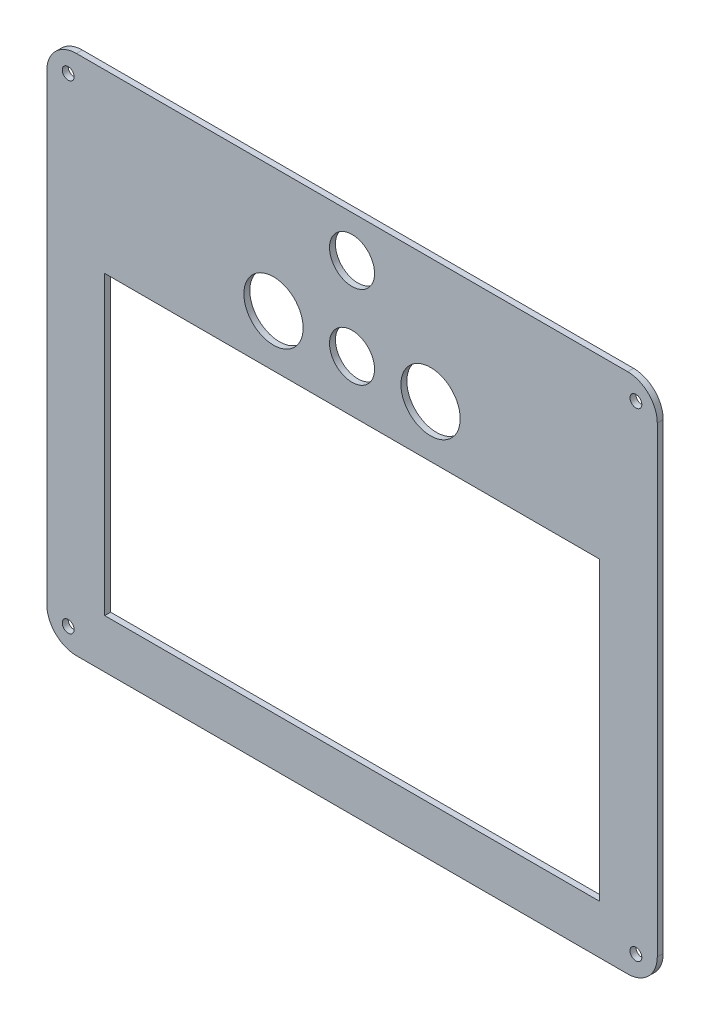
ISO-10303-21;
HEADER;
FILE_DESCRIPTION(('STEP AP214'),'2;1');
FILE_NAME('part.step','',(''),(''),'','','');
FILE_SCHEMA(('AUTOMOTIVE_DESIGN { 1 0 10303 214 1 1 1 1 }'));
ENDSEC;
DATA;
#1=APPLICATION_CONTEXT('core data for automotive mechanical design processes');
#2=APPLICATION_PROTOCOL_DEFINITION('international standard','automotive_design',2000,#1);
#3=PRODUCT_CONTEXT('',#1,'mechanical');
#4=PRODUCT('Part','Part','',(#3));
#5=PRODUCT_RELATED_PRODUCT_CATEGORY('part','',(#4));
#6=PRODUCT_DEFINITION_FORMATION('','',#4);
#7=PRODUCT_DEFINITION_CONTEXT('part definition',#1,'design');
#8=PRODUCT_DEFINITION('design','',#6,#7);
#9=PRODUCT_DEFINITION_SHAPE('','',#8);
#10=(LENGTH_UNIT() NAMED_UNIT(*) SI_UNIT(.MILLI.,.METRE.));
#11=(NAMED_UNIT(*) PLANE_ANGLE_UNIT() SI_UNIT($,.RADIAN.));
#12=(NAMED_UNIT(*) SI_UNIT($,.STERADIAN.) SOLID_ANGLE_UNIT());
#13=UNCERTAINTY_MEASURE_WITH_UNIT(LENGTH_MEASURE(1.E-05),#10,'distance_accuracy_value','');
#14=(GEOMETRIC_REPRESENTATION_CONTEXT(3) GLOBAL_UNCERTAINTY_ASSIGNED_CONTEXT((#13)) GLOBAL_UNIT_ASSIGNED_CONTEXT((#10,
#11,#12)) REPRESENTATION_CONTEXT('',''));
#15=CARTESIAN_POINT('',(0.,0.,0.));
#16=DIRECTION('',(0.,0.,1.));
#17=DIRECTION('',(1.,0.,0.));
#18=AXIS2_PLACEMENT_3D('',#15,#16,#17);
#19=CARTESIAN_POINT('',(0.,0.,2.));
#20=DIRECTION('',(1.,0.,0.));
#21=DIRECTION('',(0.,1.,0.));
#22=AXIS2_PLACEMENT_3D('',#19,#20,#21);
#23=PLANE('',#22);
#24=DIRECTION('',(0.,-1.,0.));
#25=VECTOR('',#24,1.);
#26=CARTESIAN_POINT('',(0.,0.,0.));
#27=LINE('',#26,#25);
#28=CARTESIAN_POINT('',(0.,-10.,0.));
#29=VERTEX_POINT('',#28);
#30=CARTESIAN_POINT('',(0.,-166.,0.));
#31=VERTEX_POINT('',#30);
#32=EDGE_CURVE('E230',#29,#31,#27,.T.);
#33=ORIENTED_EDGE('',*,*,#32,.T.);
#34=DIRECTION('',(0.,0.,-1.));
#35=VECTOR('',#34,1.);
#36=CARTESIAN_POINT('',(0.,-166.,2.));
#37=LINE('',#36,#35);
#38=CARTESIAN_POINT('',(0.,-166.,2.));
#39=VERTEX_POINT('',#38);
#40=EDGE_CURVE('E304',#31,#39,#37,.F.);
#41=ORIENTED_EDGE('',*,*,#40,.T.);
#42=DIRECTION('',(0.,-1.,0.));
#43=VECTOR('',#42,1.);
#44=CARTESIAN_POINT('',(0.,0.,2.));
#45=LINE('',#44,#43);
#46=CARTESIAN_POINT('',(0.,-10.,2.));
#47=VERTEX_POINT('',#46);
#48=EDGE_CURVE('E231',#47,#39,#45,.T.);
#49=ORIENTED_EDGE('',*,*,#48,.F.);
#50=DIRECTION('',(0.,0.,-1.));
#51=VECTOR('',#50,1.);
#52=CARTESIAN_POINT('',(0.,-10.,2.));
#53=LINE('',#52,#51);
#54=EDGE_CURVE('E300',#47,#29,#53,.T.);
#55=ORIENTED_EDGE('',*,*,#54,.T.);
#56=EDGE_LOOP('',(#33,#41,#49,#55));
#57=FACE_BOUND('',#56,.T.);
#58=ADVANCED_FACE('F41',(#57),#23,.F.);
#59=CARTESIAN_POINT('',(0.,-176.,2.));
#60=DIRECTION('',(0.,1.,0.));
#61=DIRECTION('',(0.,0.,1.));
#62=AXIS2_PLACEMENT_3D('',#59,#60,#61);
#63=PLANE('',#62);
#64=DIRECTION('',(1.,0.,0.));
#65=VECTOR('',#64,1.);
#66=CARTESIAN_POINT('',(0.,-176.,0.));
#67=LINE('',#66,#65);
#68=CARTESIAN_POINT('',(10.,-176.,0.));
#69=VERTEX_POINT('',#68);
#70=CARTESIAN_POINT('',(196.,-176.,0.));
#71=VERTEX_POINT('',#70);
#72=EDGE_CURVE('E252',#69,#71,#67,.T.);
#73=ORIENTED_EDGE('',*,*,#72,.T.);
#74=DIRECTION('',(0.,0.,-1.));
#75=VECTOR('',#74,1.);
#76=CARTESIAN_POINT('',(196.,-176.,2.));
#77=LINE('',#76,#75);
#78=CARTESIAN_POINT('',(196.,-176.,2.));
#79=VERTEX_POINT('',#78);
#80=EDGE_CURVE('E285',#71,#79,#77,.F.);
#81=ORIENTED_EDGE('',*,*,#80,.T.);
#82=DIRECTION('',(1.,0.,0.));
#83=VECTOR('',#82,1.);
#84=CARTESIAN_POINT('',(0.,-176.,2.));
#85=LINE('',#84,#83);
#86=CARTESIAN_POINT('',(10.,-176.,2.));
#87=VERTEX_POINT('',#86);
#88=EDGE_CURVE('E235',#87,#79,#85,.T.);
#89=ORIENTED_EDGE('',*,*,#88,.F.);
#90=DIRECTION('',(0.,0.,-1.));
#91=VECTOR('',#90,1.);
#92=CARTESIAN_POINT('',(10.,-176.,2.));
#93=LINE('',#92,#91);
#94=EDGE_CURVE('E281',#87,#69,#93,.T.);
#95=ORIENTED_EDGE('',*,*,#94,.T.);
#96=EDGE_LOOP('',(#73,#81,#89,#95));
#97=FACE_BOUND('',#96,.T.);
#98=ADVANCED_FACE('F341',(#97),#63,.F.);
#99=CARTESIAN_POINT('',(206.,0.,2.));
#100=DIRECTION('',(-1.,0.,0.));
#101=DIRECTION('',(0.,-1.,0.));
#102=AXIS2_PLACEMENT_3D('',#99,#100,#101);
#103=PLANE('',#102);
#104=DIRECTION('',(0.,1.,0.));
#105=VECTOR('',#104,1.);
#106=CARTESIAN_POINT('',(206.,0.,2.));
#107=LINE('',#106,#105);
#108=CARTESIAN_POINT('',(206.,-166.,2.));
#109=VERTEX_POINT('',#108);
#110=CARTESIAN_POINT('',(206.,-10.,2.));
#111=VERTEX_POINT('',#110);
#112=EDGE_CURVE('E240',#109,#111,#107,.T.);
#113=ORIENTED_EDGE('',*,*,#112,.F.);
#114=DIRECTION('',(0.,0.,-1.));
#115=VECTOR('',#114,1.);
#116=CARTESIAN_POINT('',(206.,-166.,2.));
#117=LINE('',#116,#115);
#118=CARTESIAN_POINT('',(206.,-166.,0.));
#119=VERTEX_POINT('',#118);
#120=EDGE_CURVE('E265',#109,#119,#117,.T.);
#121=ORIENTED_EDGE('',*,*,#120,.T.);
#122=DIRECTION('',(0.,1.,0.));
#123=VECTOR('',#122,1.);
#124=CARTESIAN_POINT('',(206.,0.,0.));
#125=LINE('',#124,#123);
#126=CARTESIAN_POINT('',(206.,-10.,0.));
#127=VERTEX_POINT('',#126);
#128=EDGE_CURVE('E256',#119,#127,#125,.T.);
#129=ORIENTED_EDGE('',*,*,#128,.T.);
#130=DIRECTION('',(0.,0.,-1.));
#131=VECTOR('',#130,1.);
#132=CARTESIAN_POINT('',(206.,-10.,2.));
#133=LINE('',#132,#131);
#134=EDGE_CURVE('E248',#127,#111,#133,.F.);
#135=ORIENTED_EDGE('',*,*,#134,.T.);
#136=EDGE_LOOP('',(#113,#121,#129,#135));
#137=FACE_BOUND('',#136,.T.);
#138=ADVANCED_FACE('F347',(#137),#103,.F.);
#139=CARTESIAN_POINT('',(0.,0.,2.));
#140=DIRECTION('',(0.,-1.,0.));
#141=DIRECTION('',(0.,0.,-1.));
#142=AXIS2_PLACEMENT_3D('',#139,#140,#141);
#143=PLANE('',#142);
#144=DIRECTION('',(-1.,0.,0.));
#145=VECTOR('',#144,1.);
#146=CARTESIAN_POINT('',(0.,0.,0.));
#147=LINE('',#146,#145);
#148=CARTESIAN_POINT('',(196.,0.,0.));
#149=VERTEX_POINT('',#148);
#150=CARTESIAN_POINT('',(10.,0.,0.));
#151=VERTEX_POINT('',#150);
#152=EDGE_CURVE('E236',#149,#151,#147,.T.);
#153=ORIENTED_EDGE('',*,*,#152,.T.);
#154=DIRECTION('',(0.,0.,-1.));
#155=VECTOR('',#154,1.);
#156=CARTESIAN_POINT('',(10.,0.,2.));
#157=LINE('',#156,#155);
#158=CARTESIAN_POINT('',(10.,0.,2.));
#159=VERTEX_POINT('',#158);
#160=EDGE_CURVE('E311',#151,#159,#157,.F.);
#161=ORIENTED_EDGE('',*,*,#160,.T.);
#162=DIRECTION('',(-1.,0.,0.));
#163=VECTOR('',#162,1.);
#164=CARTESIAN_POINT('',(0.,0.,2.));
#165=LINE('',#164,#163);
#166=CARTESIAN_POINT('',(196.,0.,2.));
#167=VERTEX_POINT('',#166);
#168=EDGE_CURVE('E244',#167,#159,#165,.T.);
#169=ORIENTED_EDGE('',*,*,#168,.F.);
#170=DIRECTION('',(0.,0.,-1.));
#171=VECTOR('',#170,1.);
#172=CARTESIAN_POINT('',(196.,0.,2.));
#173=LINE('',#172,#171);
#174=EDGE_CURVE('E307',#167,#149,#173,.T.);
#175=ORIENTED_EDGE('',*,*,#174,.T.);
#176=EDGE_LOOP('',(#153,#161,#169,#175));
#177=FACE_BOUND('',#176,.T.);
#178=ADVANCED_FACE('F389',(#177),#143,.F.);
#179=CARTESIAN_POINT('',(0.,0.,2.));
#180=DIRECTION('',(0.,0.,1.));
#181=DIRECTION('',(1.,0.,0.));
#182=AXIS2_PLACEMENT_3D('',#179,#180,#181);
#183=PLANE('',#182);
#184=DIRECTION('',(0.,-1.,0.));
#185=VECTOR('',#184,1.);
#186=CARTESIAN_POINT('',(19.55,0.,2.));
#187=LINE('',#186,#185);
#188=CARTESIAN_POINT('',(19.55,-59.5,2.));
#189=VERTEX_POINT('',#188);
#190=CARTESIAN_POINT('',(19.55,-159.5,2.));
#191=VERTEX_POINT('',#190);
#192=EDGE_CURVE('E57',#189,#191,#187,.T.);
#193=ORIENTED_EDGE('',*,*,#192,.F.);
#194=DIRECTION('',(1.,0.,0.));
#195=VECTOR('',#194,1.);
#196=CARTESIAN_POINT('',(0.,-59.5,2.));
#197=LINE('',#196,#195);
#198=CARTESIAN_POINT('',(186.45,-59.5,2.));
#199=VERTEX_POINT('',#198);
#200=EDGE_CURVE('E152',#189,#199,#197,.T.);
#201=ORIENTED_EDGE('',*,*,#200,.T.);
#202=DIRECTION('',(0.,-1.,0.));
#203=VECTOR('',#202,1.);
#204=CARTESIAN_POINT('',(186.45,0.,2.));
#205=LINE('',#204,#203);
#206=CARTESIAN_POINT('',(186.45,-159.5,2.));
#207=VERTEX_POINT('',#206);
#208=EDGE_CURVE('E134',#199,#207,#205,.T.);
#209=ORIENTED_EDGE('',*,*,#208,.T.);
#210=DIRECTION('',(1.,0.,0.));
#211=VECTOR('',#210,1.);
#212=CARTESIAN_POINT('',(0.,-159.5,2.));
#213=LINE('',#212,#211);
#214=EDGE_CURVE('E144',#191,#207,#213,.T.);
#215=ORIENTED_EDGE('',*,*,#214,.F.);
#216=EDGE_LOOP('',(#193,#201,#209,#215));
#217=FACE_BOUND('',#216,.T.);
#218=CARTESIAN_POINT('',(103.,-14.,2.));
#219=DIRECTION('',(0.,0.,1.));
#220=DIRECTION('',(1.,0.,0.));
#221=AXIS2_PLACEMENT_3D('',#218,#219,#220);
#222=CIRCLE('',#221,7.59999999999999);
#223=CARTESIAN_POINT('',(110.6,-14.,2.));
#224=VERTEX_POINT('',#223);
#225=EDGE_CURVE('E194',#224,#224,#222,.T.);
#226=ORIENTED_EDGE('',*,*,#225,.F.);
#227=EDGE_LOOP('',(#226));
#228=FACE_BOUND('',#227,.T.);
#229=CARTESIAN_POINT('',(129.5,-42.,2.));
#230=DIRECTION('',(0.,0.,1.));
#231=DIRECTION('',(1.,0.,0.));
#232=AXIS2_PLACEMENT_3D('',#229,#230,#231);
#233=CIRCLE('',#232,9.99999999999999);
#234=CARTESIAN_POINT('',(139.5,-42.,2.));
#235=VERTEX_POINT('',#234);
#236=EDGE_CURVE('E190',#235,#235,#233,.T.);
#237=ORIENTED_EDGE('',*,*,#236,.F.);
#238=EDGE_LOOP('',(#237));
#239=FACE_BOUND('',#238,.T.);
#240=CARTESIAN_POINT('',(103.,-42.,2.));
#241=DIRECTION('',(0.,0.,1.));
#242=DIRECTION('',(1.,0.,0.));
#243=AXIS2_PLACEMENT_3D('',#240,#241,#242);
#244=CIRCLE('',#243,7.6);
#245=CARTESIAN_POINT('',(110.6,-42.,2.));
#246=VERTEX_POINT('',#245);
#247=EDGE_CURVE('E186',#246,#246,#244,.T.);
#248=ORIENTED_EDGE('',*,*,#247,.F.);
#249=EDGE_LOOP('',(#248));
#250=FACE_BOUND('',#249,.T.);
#251=CARTESIAN_POINT('',(76.5,-42.,2.));
#252=DIRECTION('',(0.,0.,1.));
#253=DIRECTION('',(1.,0.,0.));
#254=AXIS2_PLACEMENT_3D('',#251,#252,#253);
#255=CIRCLE('',#254,9.99999999999999);
#256=CARTESIAN_POINT('',(86.5,-42.,2.));
#257=VERTEX_POINT('',#256);
#258=EDGE_CURVE('E171',#257,#257,#255,.T.);
#259=ORIENTED_EDGE('',*,*,#258,.F.);
#260=EDGE_LOOP('',(#259));
#261=FACE_BOUND('',#260,.T.);
#262=CARTESIAN_POINT('',(198.78553391,-168.78553391,2.));
#263=DIRECTION('',(0.,0.,1.));
#264=DIRECTION('',(1.,0.,0.));
#265=AXIS2_PLACEMENT_3D('',#262,#263,#264);
#266=CIRCLE('',#265,2.);
#267=CARTESIAN_POINT('',(200.78553391,-168.78553391,2.));
#268=VERTEX_POINT('',#267);
#269=EDGE_CURVE('E226',#268,#268,#266,.T.);
#270=ORIENTED_EDGE('',*,*,#269,.F.);
#271=EDGE_LOOP('',(#270));
#272=FACE_BOUND('',#271,.T.);
#273=CARTESIAN_POINT('',(7.21446609,-168.78553391,2.));
#274=DIRECTION('',(0.,0.,1.));
#275=DIRECTION('',(1.,0.,0.));
#276=AXIS2_PLACEMENT_3D('',#273,#274,#275);
#277=CIRCLE('',#276,2.);
#278=CARTESIAN_POINT('',(9.21446609000001,-168.78553391,2.));
#279=VERTEX_POINT('',#278);
#280=EDGE_CURVE('E222',#279,#279,#277,.T.);
#281=ORIENTED_EDGE('',*,*,#280,.F.);
#282=EDGE_LOOP('',(#281));
#283=FACE_BOUND('',#282,.T.);
#284=CARTESIAN_POINT('',(7.21446609,-7.21446609000001,2.));
#285=DIRECTION('',(0.,0.,1.));
#286=DIRECTION('',(1.,0.,0.));
#287=AXIS2_PLACEMENT_3D('',#284,#285,#286);
#288=CIRCLE('',#287,2.);
#289=CARTESIAN_POINT('',(9.21446609,-7.21446609000001,2.));
#290=VERTEX_POINT('',#289);
#291=EDGE_CURVE('E218',#290,#290,#288,.T.);
#292=ORIENTED_EDGE('',*,*,#291,.F.);
#293=EDGE_LOOP('',(#292));
#294=FACE_BOUND('',#293,.T.);
#295=CARTESIAN_POINT('',(198.78553391,-7.21446609000001,2.));
#296=DIRECTION('',(0.,0.,1.));
#297=DIRECTION('',(1.,0.,0.));
#298=AXIS2_PLACEMENT_3D('',#295,#296,#297);
#299=CIRCLE('',#298,2.);
#300=CARTESIAN_POINT('',(200.78553391,-7.21446609000001,2.));
#301=VERTEX_POINT('',#300);
#302=EDGE_CURVE('E214',#301,#301,#299,.T.);
#303=ORIENTED_EDGE('',*,*,#302,.F.);
#304=EDGE_LOOP('',(#303));
#305=FACE_BOUND('',#304,.T.);
#306=ORIENTED_EDGE('',*,*,#88,.T.);
#307=CARTESIAN_POINT('',(196.,-166.,2.));
#308=DIRECTION('',(0.,0.,1.));
#309=DIRECTION('',(1.,0.,0.));
#310=AXIS2_PLACEMENT_3D('',#307,#308,#309);
#311=CIRCLE('',#310,10.);
#312=EDGE_CURVE('E297',#79,#109,#311,.T.);
#313=ORIENTED_EDGE('',*,*,#312,.T.);
#314=ORIENTED_EDGE('',*,*,#112,.T.);
#315=CARTESIAN_POINT('',(196.,-10.,2.));
#316=DIRECTION('',(0.,0.,1.));
#317=DIRECTION('',(1.,0.,0.));
#318=AXIS2_PLACEMENT_3D('',#315,#316,#317);
#319=CIRCLE('',#318,10.);
#320=EDGE_CURVE('E288',#111,#167,#319,.T.);
#321=ORIENTED_EDGE('',*,*,#320,.T.);
#322=ORIENTED_EDGE('',*,*,#168,.T.);
#323=CARTESIAN_POINT('',(10.,-10.,2.));
#324=DIRECTION('',(0.,0.,1.));
#325=DIRECTION('',(1.,0.,0.));
#326=AXIS2_PLACEMENT_3D('',#323,#324,#325);
#327=CIRCLE('',#326,10.);
#328=EDGE_CURVE('E291',#159,#47,#327,.T.);
#329=ORIENTED_EDGE('',*,*,#328,.T.);
#330=ORIENTED_EDGE('',*,*,#48,.T.);
#331=CARTESIAN_POINT('',(10.,-166.,2.));
#332=DIRECTION('',(0.,0.,1.));
#333=DIRECTION('',(1.,0.,0.));
#334=AXIS2_PLACEMENT_3D('',#331,#332,#333);
#335=CIRCLE('',#334,10.);
#336=EDGE_CURVE('E294',#39,#87,#335,.T.);
#337=ORIENTED_EDGE('',*,*,#336,.T.);
#338=EDGE_LOOP('',(#306,#313,#314,#321,#322,#329,#330,#337));
#339=FACE_BOUND('',#338,.T.);
#340=ADVANCED_FACE('F149',(#217,#228,#239,#250,#261,#272,#283,#294,#305,#339),#183,.T.);
#341=CARTESIAN_POINT('',(0.,0.,0.));
#342=DIRECTION('',(0.,0.,1.));
#343=DIRECTION('',(1.,0.,0.));
#344=AXIS2_PLACEMENT_3D('',#341,#342,#343);
#345=PLANE('',#344);
#346=DIRECTION('',(1.,0.,0.));
#347=VECTOR('',#346,1.);
#348=CARTESIAN_POINT('',(0.,-59.5,0.));
#349=LINE('',#348,#347);
#350=CARTESIAN_POINT('',(19.55,-59.5,0.));
#351=VERTEX_POINT('',#350);
#352=CARTESIAN_POINT('',(186.45,-59.5,0.));
#353=VERTEX_POINT('',#352);
#354=EDGE_CURVE('E50',#351,#353,#349,.T.);
#355=ORIENTED_EDGE('',*,*,#354,.F.);
#356=DIRECTION('',(0.,-1.,0.));
#357=VECTOR('',#356,1.);
#358=CARTESIAN_POINT('',(19.55,0.,0.));
#359=LINE('',#358,#357);
#360=CARTESIAN_POINT('',(19.55,-159.5,0.));
#361=VERTEX_POINT('',#360);
#362=EDGE_CURVE('E11',#351,#361,#359,.T.);
#363=ORIENTED_EDGE('',*,*,#362,.T.);
#364=DIRECTION('',(1.,0.,0.));
#365=VECTOR('',#364,1.);
#366=CARTESIAN_POINT('',(0.,-159.5,0.));
#367=LINE('',#366,#365);
#368=CARTESIAN_POINT('',(186.45,-159.5,0.));
#369=VERTEX_POINT('',#368);
#370=EDGE_CURVE('E314',#361,#369,#367,.T.);
#371=ORIENTED_EDGE('',*,*,#370,.T.);
#372=DIRECTION('',(0.,-1.,0.));
#373=VECTOR('',#372,1.);
#374=CARTESIAN_POINT('',(186.45,0.,0.));
#375=LINE('',#374,#373);
#376=EDGE_CURVE('E137',#353,#369,#375,.T.);
#377=ORIENTED_EDGE('',*,*,#376,.F.);
#378=EDGE_LOOP('',(#355,#363,#371,#377));
#379=FACE_BOUND('',#378,.T.);
#380=CARTESIAN_POINT('',(103.,-14.,0.));
#381=DIRECTION('',(0.,0.,-1.));
#382=DIRECTION('',(-1.,0.,0.));
#383=AXIS2_PLACEMENT_3D('',#380,#381,#382);
#384=CIRCLE('',#383,7.59999999999999);
#385=CARTESIAN_POINT('',(95.4,-14.,0.));
#386=VERTEX_POINT('',#385);
#387=EDGE_CURVE('E167',#386,#386,#384,.T.);
#388=ORIENTED_EDGE('',*,*,#387,.F.);
#389=EDGE_LOOP('',(#388));
#390=FACE_BOUND('',#389,.T.);
#391=CARTESIAN_POINT('',(129.5,-42.,0.));
#392=DIRECTION('',(0.,0.,-1.));
#393=DIRECTION('',(-1.,0.,0.));
#394=AXIS2_PLACEMENT_3D('',#391,#392,#393);
#395=CIRCLE('',#394,9.99999999999999);
#396=CARTESIAN_POINT('',(119.5,-42.,0.));
#397=VERTEX_POINT('',#396);
#398=EDGE_CURVE('E172',#397,#397,#395,.T.);
#399=ORIENTED_EDGE('',*,*,#398,.F.);
#400=EDGE_LOOP('',(#399));
#401=FACE_BOUND('',#400,.T.);
#402=CARTESIAN_POINT('',(103.,-42.,0.));
#403=DIRECTION('',(0.,0.,-1.));
#404=DIRECTION('',(-1.,0.,0.));
#405=AXIS2_PLACEMENT_3D('',#402,#403,#404);
#406=CIRCLE('',#405,7.6);
#407=CARTESIAN_POINT('',(95.4,-42.,0.));
#408=VERTEX_POINT('',#407);
#409=EDGE_CURVE('E176',#408,#408,#406,.T.);
#410=ORIENTED_EDGE('',*,*,#409,.F.);
#411=EDGE_LOOP('',(#410));
#412=FACE_BOUND('',#411,.T.);
#413=CARTESIAN_POINT('',(76.5,-42.,0.));
#414=DIRECTION('',(0.,0.,-1.));
#415=DIRECTION('',(-1.,0.,0.));
#416=AXIS2_PLACEMENT_3D('',#413,#414,#415);
#417=CIRCLE('',#416,9.99999999999999);
#418=CARTESIAN_POINT('',(66.5,-42.,0.));
#419=VERTEX_POINT('',#418);
#420=EDGE_CURVE('E162',#419,#419,#417,.T.);
#421=ORIENTED_EDGE('',*,*,#420,.F.);
#422=EDGE_LOOP('',(#421));
#423=FACE_BOUND('',#422,.T.);
#424=CARTESIAN_POINT('',(198.78553391,-168.78553391,0.));
#425=DIRECTION('',(0.,0.,-1.));
#426=DIRECTION('',(-1.,0.,0.));
#427=AXIS2_PLACEMENT_3D('',#424,#425,#426);
#428=CIRCLE('',#427,2.);
#429=CARTESIAN_POINT('',(196.78553391,-168.78553391,0.));
#430=VERTEX_POINT('',#429);
#431=EDGE_CURVE('E198',#430,#430,#428,.T.);
#432=ORIENTED_EDGE('',*,*,#431,.F.);
#433=EDGE_LOOP('',(#432));
#434=FACE_BOUND('',#433,.T.);
#435=CARTESIAN_POINT('',(7.21446609,-168.78553391,0.));
#436=DIRECTION('',(0.,0.,-1.));
#437=DIRECTION('',(-1.,0.,0.));
#438=AXIS2_PLACEMENT_3D('',#435,#436,#437);
#439=CIRCLE('',#438,2.);
#440=CARTESIAN_POINT('',(5.21446609,-168.78553391,0.));
#441=VERTEX_POINT('',#440);
#442=EDGE_CURVE('E204',#441,#441,#439,.T.);
#443=ORIENTED_EDGE('',*,*,#442,.F.);
#444=EDGE_LOOP('',(#443));
#445=FACE_BOUND('',#444,.T.);
#446=CARTESIAN_POINT('',(7.21446609,-7.21446609000001,0.));
#447=DIRECTION('',(0.,0.,-1.));
#448=DIRECTION('',(-1.,0.,0.));
#449=AXIS2_PLACEMENT_3D('',#446,#447,#448);
#450=CIRCLE('',#449,2.);
#451=CARTESIAN_POINT('',(5.21446609,-7.21446609000001,0.));
#452=VERTEX_POINT('',#451);
#453=EDGE_CURVE('E199',#452,#452,#450,.T.);
#454=ORIENTED_EDGE('',*,*,#453,.F.);
#455=EDGE_LOOP('',(#454));
#456=FACE_BOUND('',#455,.T.);
#457=CARTESIAN_POINT('',(198.78553391,-7.21446609000001,0.));
#458=DIRECTION('',(0.,0.,-1.));
#459=DIRECTION('',(-1.,0.,0.));
#460=AXIS2_PLACEMENT_3D('',#457,#458,#459);
#461=CIRCLE('',#460,2.);
#462=CARTESIAN_POINT('',(196.78553391,-7.21446609000001,0.));
#463=VERTEX_POINT('',#462);
#464=EDGE_CURVE('E203',#463,#463,#461,.T.);
#465=ORIENTED_EDGE('',*,*,#464,.F.);
#466=EDGE_LOOP('',(#465));
#467=FACE_BOUND('',#466,.T.);
#468=ORIENTED_EDGE('',*,*,#128,.F.);
#469=CARTESIAN_POINT('',(196.,-166.,0.));
#470=DIRECTION('',(0.,0.,1.));
#471=DIRECTION('',(1.,0.,0.));
#472=AXIS2_PLACEMENT_3D('',#469,#470,#471);
#473=CIRCLE('',#472,10.);
#474=EDGE_CURVE('E278',#119,#71,#473,.F.);
#475=ORIENTED_EDGE('',*,*,#474,.T.);
#476=ORIENTED_EDGE('',*,*,#72,.F.);
#477=CARTESIAN_POINT('',(10.,-166.,0.));
#478=DIRECTION('',(0.,0.,1.));
#479=DIRECTION('',(1.,0.,0.));
#480=AXIS2_PLACEMENT_3D('',#477,#478,#479);
#481=CIRCLE('',#480,10.);
#482=EDGE_CURVE('E275',#69,#31,#481,.F.);
#483=ORIENTED_EDGE('',*,*,#482,.T.);
#484=ORIENTED_EDGE('',*,*,#32,.F.);
#485=CARTESIAN_POINT('',(10.,-10.,0.));
#486=DIRECTION('',(0.,0.,1.));
#487=DIRECTION('',(1.,0.,0.));
#488=AXIS2_PLACEMENT_3D('',#485,#486,#487);
#489=CIRCLE('',#488,10.);
#490=EDGE_CURVE('E272',#29,#151,#489,.F.);
#491=ORIENTED_EDGE('',*,*,#490,.T.);
#492=ORIENTED_EDGE('',*,*,#152,.F.);
#493=CARTESIAN_POINT('',(196.,-10.,0.));
#494=DIRECTION('',(0.,0.,1.));
#495=DIRECTION('',(1.,0.,0.));
#496=AXIS2_PLACEMENT_3D('',#493,#494,#495);
#497=CIRCLE('',#496,10.);
#498=EDGE_CURVE('E269',#149,#127,#497,.F.);
#499=ORIENTED_EDGE('',*,*,#498,.T.);
#500=EDGE_LOOP('',(#468,#475,#476,#483,#484,#491,#492,#499));
#501=FACE_BOUND('',#500,.T.);
#502=ADVANCED_FACE('F324',(#379,#390,#401,#412,#423,#434,#445,#456,#467,#501),#345,.F.);
#503=CARTESIAN_POINT('',(196.,-166.,2.));
#504=DIRECTION('',(0.,0.,-1.));
#505=DIRECTION('',(-1.,0.,0.));
#506=AXIS2_PLACEMENT_3D('',#503,#504,#505);
#507=CYLINDRICAL_SURFACE('',#506,10.);
#508=ORIENTED_EDGE('',*,*,#312,.F.);
#509=ORIENTED_EDGE('',*,*,#80,.F.);
#510=ORIENTED_EDGE('',*,*,#474,.F.);
#511=ORIENTED_EDGE('',*,*,#120,.F.);
#512=EDGE_LOOP('',(#508,#509,#510,#511));
#513=FACE_BOUND('',#512,.T.);
#514=ADVANCED_FACE('F352',(#513),#507,.T.);
#515=CARTESIAN_POINT('',(10.,-166.,2.));
#516=DIRECTION('',(0.,0.,-1.));
#517=DIRECTION('',(-1.,0.,0.));
#518=AXIS2_PLACEMENT_3D('',#515,#516,#517);
#519=CYLINDRICAL_SURFACE('',#518,10.);
#520=ORIENTED_EDGE('',*,*,#336,.F.);
#521=ORIENTED_EDGE('',*,*,#40,.F.);
#522=ORIENTED_EDGE('',*,*,#482,.F.);
#523=ORIENTED_EDGE('',*,*,#94,.F.);
#524=EDGE_LOOP('',(#520,#521,#522,#523));
#525=FACE_BOUND('',#524,.T.);
#526=ADVANCED_FACE('F355',(#525),#519,.T.);
#527=CARTESIAN_POINT('',(10.,-10.,2.));
#528=DIRECTION('',(0.,0.,-1.));
#529=DIRECTION('',(-1.,0.,0.));
#530=AXIS2_PLACEMENT_3D('',#527,#528,#529);
#531=CYLINDRICAL_SURFACE('',#530,10.);
#532=ORIENTED_EDGE('',*,*,#328,.F.);
#533=ORIENTED_EDGE('',*,*,#160,.F.);
#534=ORIENTED_EDGE('',*,*,#490,.F.);
#535=ORIENTED_EDGE('',*,*,#54,.F.);
#536=EDGE_LOOP('',(#532,#533,#534,#535));
#537=FACE_BOUND('',#536,.T.);
#538=ADVANCED_FACE('F358',(#537),#531,.T.);
#539=CARTESIAN_POINT('',(196.,-10.,2.));
#540=DIRECTION('',(0.,0.,-1.));
#541=DIRECTION('',(-1.,0.,0.));
#542=AXIS2_PLACEMENT_3D('',#539,#540,#541);
#543=CYLINDRICAL_SURFACE('',#542,10.);
#544=ORIENTED_EDGE('',*,*,#320,.F.);
#545=ORIENTED_EDGE('',*,*,#134,.F.);
#546=ORIENTED_EDGE('',*,*,#498,.F.);
#547=ORIENTED_EDGE('',*,*,#174,.F.);
#548=EDGE_LOOP('',(#544,#545,#546,#547));
#549=FACE_BOUND('',#548,.T.);
#550=ADVANCED_FACE('F43',(#549),#543,.T.);
#551=CARTESIAN_POINT('',(198.78553391,-7.21446609000001,5.));
#552=DIRECTION('',(0.,0.,-1.));
#553=DIRECTION('',(-1.,0.,0.));
#554=AXIS2_PLACEMENT_3D('',#551,#552,#553);
#555=CYLINDRICAL_SURFACE('',#554,2.);
#556=ORIENTED_EDGE('',*,*,#302,.T.);
#557=EDGE_LOOP('',(#556));
#558=FACE_BOUND('',#557,.T.);
#559=ORIENTED_EDGE('',*,*,#464,.T.);
#560=EDGE_LOOP('',(#559));
#561=FACE_BOUND('',#560,.T.);
#562=ADVANCED_FACE('F365',(#558,#561),#555,.F.);
#563=CARTESIAN_POINT('',(7.21446609,-7.21446609000001,5.));
#564=DIRECTION('',(0.,0.,-1.));
#565=DIRECTION('',(-1.,0.,0.));
#566=AXIS2_PLACEMENT_3D('',#563,#564,#565);
#567=CYLINDRICAL_SURFACE('',#566,2.);
#568=ORIENTED_EDGE('',*,*,#291,.T.);
#569=EDGE_LOOP('',(#568));
#570=FACE_BOUND('',#569,.T.);
#571=ORIENTED_EDGE('',*,*,#453,.T.);
#572=EDGE_LOOP('',(#571));
#573=FACE_BOUND('',#572,.T.);
#574=ADVANCED_FACE('F498',(#570,#573),#567,.F.);
#575=CARTESIAN_POINT('',(7.21446609,-168.78553391,5.));
#576=DIRECTION('',(0.,0.,-1.));
#577=DIRECTION('',(-1.,0.,0.));
#578=AXIS2_PLACEMENT_3D('',#575,#576,#577);
#579=CYLINDRICAL_SURFACE('',#578,2.);
#580=ORIENTED_EDGE('',*,*,#280,.T.);
#581=EDGE_LOOP('',(#580));
#582=FACE_BOUND('',#581,.T.);
#583=ORIENTED_EDGE('',*,*,#442,.T.);
#584=EDGE_LOOP('',(#583));
#585=FACE_BOUND('',#584,.T.);
#586=ADVANCED_FACE('F489',(#582,#585),#579,.F.);
#587=CARTESIAN_POINT('',(198.78553391,-168.78553391,5.));
#588=DIRECTION('',(0.,0.,-1.));
#589=DIRECTION('',(-1.,0.,0.));
#590=AXIS2_PLACEMENT_3D('',#587,#588,#589);
#591=CYLINDRICAL_SURFACE('',#590,2.);
#592=ORIENTED_EDGE('',*,*,#269,.T.);
#593=EDGE_LOOP('',(#592));
#594=FACE_BOUND('',#593,.T.);
#595=ORIENTED_EDGE('',*,*,#431,.T.);
#596=EDGE_LOOP('',(#595));
#597=FACE_BOUND('',#596,.T.);
#598=ADVANCED_FACE('F480',(#594,#597),#591,.F.);
#599=CARTESIAN_POINT('',(76.5,-42.,5.));
#600=DIRECTION('',(0.,0.,-1.));
#601=DIRECTION('',(-1.,0.,0.));
#602=AXIS2_PLACEMENT_3D('',#599,#600,#601);
#603=CYLINDRICAL_SURFACE('',#602,9.99999999999999);
#604=ORIENTED_EDGE('',*,*,#258,.T.);
#605=EDGE_LOOP('',(#604));
#606=FACE_BOUND('',#605,.T.);
#607=ORIENTED_EDGE('',*,*,#420,.T.);
#608=EDGE_LOOP('',(#607));
#609=FACE_BOUND('',#608,.T.);
#610=ADVANCED_FACE('F471',(#606,#609),#603,.F.);
#611=CARTESIAN_POINT('',(103.,-42.,5.));
#612=DIRECTION('',(0.,0.,-1.));
#613=DIRECTION('',(-1.,0.,0.));
#614=AXIS2_PLACEMENT_3D('',#611,#612,#613);
#615=CYLINDRICAL_SURFACE('',#614,7.6);
#616=ORIENTED_EDGE('',*,*,#247,.T.);
#617=EDGE_LOOP('',(#616));
#618=FACE_BOUND('',#617,.T.);
#619=ORIENTED_EDGE('',*,*,#409,.T.);
#620=EDGE_LOOP('',(#619));
#621=FACE_BOUND('',#620,.T.);
#622=ADVANCED_FACE('F462',(#618,#621),#615,.F.);
#623=CARTESIAN_POINT('',(129.5,-42.,5.));
#624=DIRECTION('',(0.,0.,-1.));
#625=DIRECTION('',(-1.,0.,0.));
#626=AXIS2_PLACEMENT_3D('',#623,#624,#625);
#627=CYLINDRICAL_SURFACE('',#626,9.99999999999999);
#628=ORIENTED_EDGE('',*,*,#236,.T.);
#629=EDGE_LOOP('',(#628));
#630=FACE_BOUND('',#629,.T.);
#631=ORIENTED_EDGE('',*,*,#398,.T.);
#632=EDGE_LOOP('',(#631));
#633=FACE_BOUND('',#632,.T.);
#634=ADVANCED_FACE('F336',(#630,#633),#627,.F.);
#635=CARTESIAN_POINT('',(103.,-14.,5.));
#636=DIRECTION('',(0.,0.,-1.));
#637=DIRECTION('',(-1.,0.,0.));
#638=AXIS2_PLACEMENT_3D('',#635,#636,#637);
#639=CYLINDRICAL_SURFACE('',#638,7.59999999999999);
#640=ORIENTED_EDGE('',*,*,#225,.T.);
#641=EDGE_LOOP('',(#640));
#642=FACE_BOUND('',#641,.T.);
#643=ORIENTED_EDGE('',*,*,#387,.T.);
#644=EDGE_LOOP('',(#643));
#645=FACE_BOUND('',#644,.T.);
#646=ADVANCED_FACE('F329',(#642,#645),#639,.F.);
#647=CARTESIAN_POINT('',(19.55,0.,-8.));
#648=DIRECTION('',(-1.,0.,0.));
#649=DIRECTION('',(0.,-1.,0.));
#650=AXIS2_PLACEMENT_3D('',#647,#648,#649);
#651=PLANE('',#650);
#652=DIRECTION('',(0.,0.,1.));
#653=VECTOR('',#652,1.);
#654=CARTESIAN_POINT('',(19.55,-59.5,-8.));
#655=LINE('',#654,#653);
#656=EDGE_CURVE('E159',#351,#189,#655,.T.);
#657=ORIENTED_EDGE('',*,*,#656,.T.);
#658=ORIENTED_EDGE('',*,*,#192,.T.);
#659=DIRECTION('',(0.,0.,1.));
#660=VECTOR('',#659,1.);
#661=CARTESIAN_POINT('',(19.55,-159.5,-8.));
#662=LINE('',#661,#660);
#663=EDGE_CURVE('E141',#361,#191,#662,.T.);
#664=ORIENTED_EDGE('',*,*,#663,.F.);
#665=ORIENTED_EDGE('',*,*,#362,.F.);
#666=EDGE_LOOP('',(#657,#658,#664,#665));
#667=FACE_BOUND('',#666,.T.);
#668=ADVANCED_FACE('F326',(#667),#651,.F.);
#669=CARTESIAN_POINT('',(0.,-59.5,-8.));
#670=DIRECTION('',(0.,-1.,0.));
#671=DIRECTION('',(0.,0.,-1.));
#672=AXIS2_PLACEMENT_3D('',#669,#670,#671);
#673=PLANE('',#672);
#674=ORIENTED_EDGE('',*,*,#354,.T.);
#675=DIRECTION('',(0.,0.,1.));
#676=VECTOR('',#675,1.);
#677=CARTESIAN_POINT('',(186.45,-59.5,-8.));
#678=LINE('',#677,#676);
#679=EDGE_CURVE('E140',#353,#199,#678,.T.);
#680=ORIENTED_EDGE('',*,*,#679,.T.);
#681=ORIENTED_EDGE('',*,*,#200,.F.);
#682=ORIENTED_EDGE('',*,*,#656,.F.);
#683=EDGE_LOOP('',(#674,#680,#681,#682));
#684=FACE_BOUND('',#683,.T.);
#685=ADVANCED_FACE('F322',(#684),#673,.T.);
#686=CARTESIAN_POINT('',(186.45,0.,-8.));
#687=DIRECTION('',(-1.,0.,0.));
#688=DIRECTION('',(0.,0.,1.));
#689=AXIS2_PLACEMENT_3D('',#686,#687,#688);
#690=PLANE('',#689);
#691=ORIENTED_EDGE('',*,*,#376,.T.);
#692=DIRECTION('',(0.,0.,1.));
#693=VECTOR('',#692,1.);
#694=CARTESIAN_POINT('',(186.45,-159.5,-8.));
#695=LINE('',#694,#693);
#696=EDGE_CURVE('E65',#369,#207,#695,.T.);
#697=ORIENTED_EDGE('',*,*,#696,.T.);
#698=ORIENTED_EDGE('',*,*,#208,.F.);
#699=ORIENTED_EDGE('',*,*,#679,.F.);
#700=EDGE_LOOP('',(#691,#697,#698,#699));
#701=FACE_BOUND('',#700,.T.);
#702=ADVANCED_FACE('F131',(#701),#690,.T.);
#703=CARTESIAN_POINT('',(0.,-159.5,-8.));
#704=DIRECTION('',(0.,-1.,0.));
#705=DIRECTION('',(0.,0.,-1.));
#706=AXIS2_PLACEMENT_3D('',#703,#704,#705);
#707=PLANE('',#706);
#708=ORIENTED_EDGE('',*,*,#663,.T.);
#709=ORIENTED_EDGE('',*,*,#214,.T.);
#710=ORIENTED_EDGE('',*,*,#696,.F.);
#711=ORIENTED_EDGE('',*,*,#370,.F.);
#712=EDGE_LOOP('',(#708,#709,#710,#711));
#713=FACE_BOUND('',#712,.T.);
#714=ADVANCED_FACE('F145',(#713),#707,.F.);
#715=CLOSED_SHELL('',(#58,#98,#138,#178,#340,#502,#514,#526,#538,#550,#562,#574,#586,#598,#610,
#622,#634,#646,#668,#685,#702,#714));
#716=MANIFOLD_SOLID_BREP('B2',#715);
#717=ADVANCED_BREP_SHAPE_REPRESENTATION('',(#18,#716),#14);
#718=SHAPE_DEFINITION_REPRESENTATION(#9,#717);
ENDSEC;
END-ISO-10303-21;
